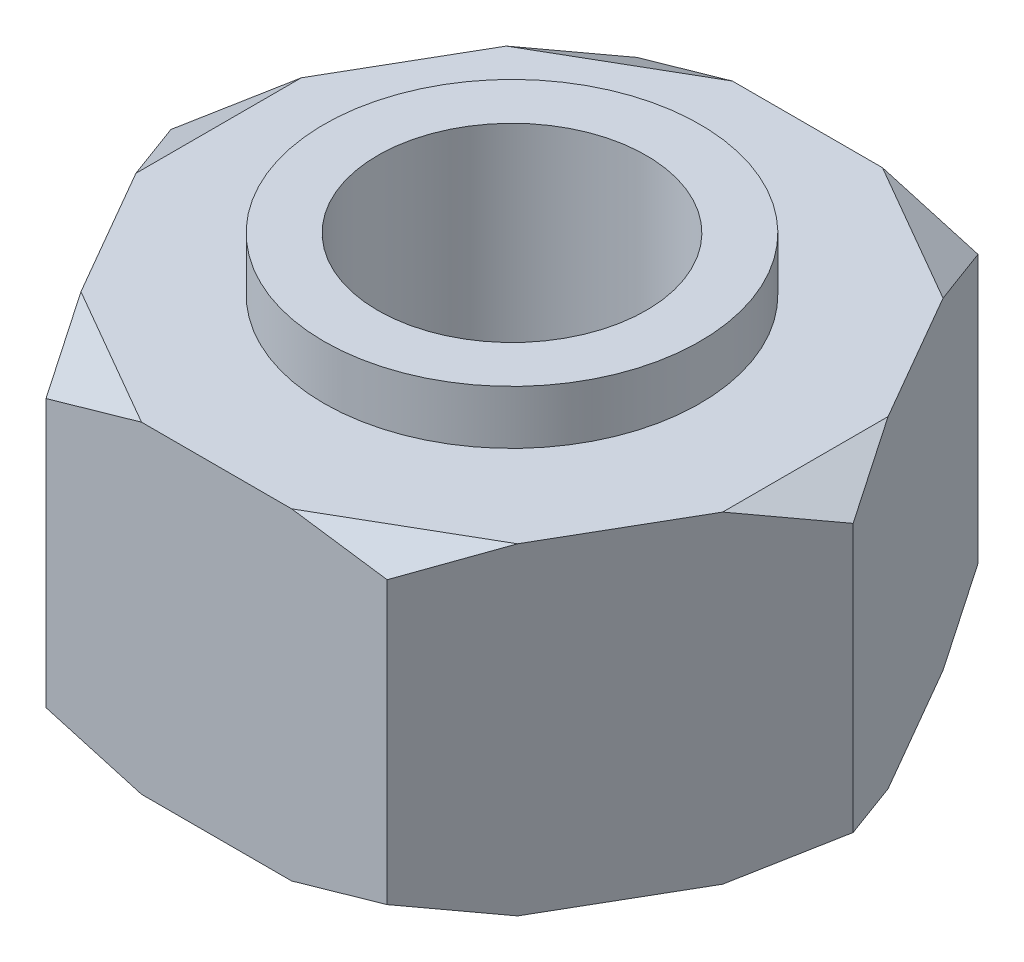
ISO-10303-21;
HEADER;
FILE_DESCRIPTION(('STEP AP214'),'2;1');
FILE_NAME('part.step','',(''),(''),'','','');
FILE_SCHEMA(('AUTOMOTIVE_DESIGN { 1 0 10303 214 1 1 1 1 }'));
ENDSEC;
DATA;
#1=APPLICATION_CONTEXT('core data for automotive mechanical design processes');
#2=APPLICATION_PROTOCOL_DEFINITION('international standard','automotive_design',2000,#1);
#3=PRODUCT_CONTEXT('',#1,'mechanical');
#4=PRODUCT('Part','Part','',(#3));
#5=PRODUCT_RELATED_PRODUCT_CATEGORY('part','',(#4));
#6=PRODUCT_DEFINITION_FORMATION('','',#4);
#7=PRODUCT_DEFINITION_CONTEXT('part definition',#1,'design');
#8=PRODUCT_DEFINITION('design','',#6,#7);
#9=PRODUCT_DEFINITION_SHAPE('','',#8);
#10=(LENGTH_UNIT() NAMED_UNIT(*) SI_UNIT(.MILLI.,.METRE.));
#11=(NAMED_UNIT(*) PLANE_ANGLE_UNIT() SI_UNIT($,.RADIAN.));
#12=(NAMED_UNIT(*) SI_UNIT($,.STERADIAN.) SOLID_ANGLE_UNIT());
#13=UNCERTAINTY_MEASURE_WITH_UNIT(LENGTH_MEASURE(1.E-05),#10,'distance_accuracy_value','');
#14=(GEOMETRIC_REPRESENTATION_CONTEXT(3) GLOBAL_UNCERTAINTY_ASSIGNED_CONTEXT((#13)) GLOBAL_UNIT_ASSIGNED_CONTEXT((#10,
#11,#12)) REPRESENTATION_CONTEXT('',''));
#15=CARTESIAN_POINT('',(0.,0.,0.));
#16=DIRECTION('',(0.,0.,1.));
#17=DIRECTION('',(1.,0.,0.));
#18=AXIS2_PLACEMENT_3D('',#15,#16,#17);
#19=CARTESIAN_POINT('',(0.,0.,0.));
#20=DIRECTION('',(0.,1.,0.));
#21=DIRECTION('',(0.,0.,1.));
#22=AXIS2_PLACEMENT_3D('',#19,#20,#21);
#23=PLANE('',#22);
#24=CARTESIAN_POINT('',(0.,0.,0.));
#25=DIRECTION('',(0.,1.,0.));
#26=DIRECTION('',(0.,0.,1.));
#27=AXIS2_PLACEMENT_3D('',#24,#25,#26);
#28=CIRCLE('',#27,2.5);
#29=CARTESIAN_POINT('',(0.,0.,2.5));
#30=VERTEX_POINT('',#29);
#31=EDGE_CURVE('E400',#30,#30,#28,.F.);
#32=ORIENTED_EDGE('',*,*,#31,.F.);
#33=EDGE_LOOP('',(#32));
#34=FACE_BOUND('',#33,.T.);
#35=DIRECTION('',(-0.5,0.,0.866025403784438));
#36=VECTOR('',#35,1.);
#37=CARTESIAN_POINT('',(-3.17542648054294,0.,-5.5));
#38=LINE('',#37,#36);
#39=CARTESIAN_POINT('',(-4.06442648054294,0.,-3.96020683207127));
#40=VERTEX_POINT('',#39);
#41=CARTESIAN_POINT('',(-5.46185296108588,0.,-1.53979316792873));
#42=VERTEX_POINT('',#41);
#43=EDGE_CURVE('E175',#40,#42,#38,.T.);
#44=ORIENTED_EDGE('',*,*,#43,.F.);
#45=DIRECTION('',(0.866025403784439,0.,-0.5));
#46=VECTOR('',#45,1.);
#47=CARTESIAN_POINT('',(-2.73092648054294,0.,-4.73010341603564));
#48=LINE('',#47,#46);
#49=CARTESIAN_POINT('',(-1.39742648054295,0.,-5.5));
#50=VERTEX_POINT('',#49);
#51=EDGE_CURVE('E11',#40,#50,#48,.T.);
#52=ORIENTED_EDGE('',*,*,#51,.T.);
#53=DIRECTION('',(-1.,0.,0.));
#54=VECTOR('',#53,1.);
#55=CARTESIAN_POINT('',(3.17542648054294,0.,-5.5));
#56=LINE('',#55,#54);
#57=CARTESIAN_POINT('',(1.39742648054294,0.,-5.5));
#58=VERTEX_POINT('',#57);
#59=EDGE_CURVE('E184',#58,#50,#56,.T.);
#60=ORIENTED_EDGE('',*,*,#59,.F.);
#61=DIRECTION('',(-0.866025403784439,0.,-0.5));
#62=VECTOR('',#61,1.);
#63=CARTESIAN_POINT('',(2.73092648054294,0.,-4.73010341603564));
#64=LINE('',#63,#62);
#65=CARTESIAN_POINT('',(4.06442648054294,0.,-3.96020683207127));
#66=VERTEX_POINT('',#65);
#67=EDGE_CURVE('E297',#66,#58,#64,.T.);
#68=ORIENTED_EDGE('',*,*,#67,.F.);
#69=DIRECTION('',(-0.5,0.,-0.866025403784439));
#70=VECTOR('',#69,1.);
#71=CARTESIAN_POINT('',(6.35085296108588,0.,0.));
#72=LINE('',#71,#70);
#73=CARTESIAN_POINT('',(5.46185296108588,0.,-1.53979316792873));
#74=VERTEX_POINT('',#73);
#75=EDGE_CURVE('E190',#74,#66,#72,.T.);
#76=ORIENTED_EDGE('',*,*,#75,.F.);
#77=DIRECTION('',(0.,0.,-1.));
#78=VECTOR('',#77,1.);
#79=CARTESIAN_POINT('',(5.46185296108588,0.,0.));
#80=LINE('',#79,#78);
#81=CARTESIAN_POINT('',(5.46185296108589,0.,1.53979316792872));
#82=VERTEX_POINT('',#81);
#83=EDGE_CURVE('E309',#82,#74,#80,.T.);
#84=ORIENTED_EDGE('',*,*,#83,.F.);
#85=DIRECTION('',(0.5,0.,-0.866025403784439));
#86=VECTOR('',#85,1.);
#87=CARTESIAN_POINT('',(3.17542648054294,0.,5.5));
#88=LINE('',#87,#86);
#89=CARTESIAN_POINT('',(4.06442648054294,0.,3.96020683207127));
#90=VERTEX_POINT('',#89);
#91=EDGE_CURVE('E386',#90,#82,#88,.T.);
#92=ORIENTED_EDGE('',*,*,#91,.F.);
#93=DIRECTION('',(0.866025403784439,0.,-0.5));
#94=VECTOR('',#93,1.);
#95=CARTESIAN_POINT('',(2.73092648054294,0.,4.73010341603564));
#96=LINE('',#95,#94);
#97=CARTESIAN_POINT('',(1.39742648054294,0.,5.5));
#98=VERTEX_POINT('',#97);
#99=EDGE_CURVE('E321',#98,#90,#96,.T.);
#100=ORIENTED_EDGE('',*,*,#99,.F.);
#101=DIRECTION('',(1.,0.,0.));
#102=VECTOR('',#101,1.);
#103=CARTESIAN_POINT('',(-3.17542648054294,0.,5.5));
#104=LINE('',#103,#102);
#105=CARTESIAN_POINT('',(-1.39742648054294,0.,5.5));
#106=VERTEX_POINT('',#105);
#107=EDGE_CURVE('E188',#106,#98,#104,.T.);
#108=ORIENTED_EDGE('',*,*,#107,.F.);
#109=DIRECTION('',(0.866025403784439,0.,0.5));
#110=VECTOR('',#109,1.);
#111=CARTESIAN_POINT('',(-2.73092648054294,0.,4.73010341603564));
#112=LINE('',#111,#110);
#113=CARTESIAN_POINT('',(-4.06442648054294,0.,3.96020683207127));
#114=VERTEX_POINT('',#113);
#115=EDGE_CURVE('E333',#114,#106,#112,.T.);
#116=ORIENTED_EDGE('',*,*,#115,.F.);
#117=DIRECTION('',(0.5,0.,0.866025403784439));
#118=VECTOR('',#117,1.);
#119=CARTESIAN_POINT('',(-6.35085296108588,0.,0.));
#120=LINE('',#119,#118);
#121=CARTESIAN_POINT('',(-5.46185296108588,0.,1.53979316792873));
#122=VERTEX_POINT('',#121);
#123=EDGE_CURVE('E183',#122,#114,#120,.T.);
#124=ORIENTED_EDGE('',*,*,#123,.F.);
#125=DIRECTION('',(0.,0.,1.));
#126=VECTOR('',#125,1.);
#127=CARTESIAN_POINT('',(-5.46185296108588,0.,0.));
#128=LINE('',#127,#126);
#129=EDGE_CURVE('E181',#42,#122,#128,.T.);
#130=ORIENTED_EDGE('',*,*,#129,.F.);
#131=EDGE_LOOP('',(#44,#52,#60,#68,#76,#84,#92,#100,#108,#116,#124,#130));
#132=FACE_BOUND('',#131,.T.);
#133=ADVANCED_FACE('F45',(#34,#132),#23,.F.);
#134=CARTESIAN_POINT('',(-3.17542648054294,6.,-5.5));
#135=DIRECTION('',(0.866025403784439,0.,0.5));
#136=DIRECTION('',(0.5,0.,-0.866025403784439));
#137=AXIS2_PLACEMENT_3D('',#134,#135,#136);
#138=PLANE('',#137);
#139=DIRECTION('',(0.,-1.,0.));
#140=VECTOR('',#139,1.);
#141=CARTESIAN_POINT('',(-3.17542648054294,6.,-5.5));
#142=LINE('',#141,#140);
#143=CARTESIAN_POINT('',(-3.17542648054294,5.492,-5.5));
#144=VERTEX_POINT('',#143);
#145=CARTESIAN_POINT('',(-3.17542648054294,0.507999999999998,-5.5));
#146=VERTEX_POINT('',#145);
#147=EDGE_CURVE('E178',#144,#146,#142,.T.);
#148=ORIENTED_EDGE('',*,*,#147,.T.);
#149=DIRECTION('',(-0.480761973820412,-0.274721127897378,0.832704165004051));
#150=VECTOR('',#149,1.);
#151=CARTESIAN_POINT('',(-2.4500679899769,0.922490566037735,-6.75635775936185));
#152=LINE('',#151,#150);
#153=EDGE_CURVE('E54',#146,#40,#152,.T.);
#154=ORIENTED_EDGE('',*,*,#153,.T.);
#155=ORIENTED_EDGE('',*,*,#43,.T.);
#156=DIRECTION('',(0.480761973820412,-0.274721127897378,-0.832704165004051));
#157=VECTOR('',#156,1.);
#158=CARTESIAN_POINT('',(-4.1404397998292,-0.755093235003819,-3.82854790101551));
#159=LINE('',#158,#157);
#160=CARTESIAN_POINT('',(-6.35085296108588,0.507999999999999,0.));
#161=VERTEX_POINT('',#160);
#162=EDGE_CURVE('E68',#161,#42,#159,.T.);
#163=ORIENTED_EDGE('',*,*,#162,.F.);
#164=DIRECTION('',(0.,-1.,0.));
#165=VECTOR('',#164,1.);
#166=CARTESIAN_POINT('',(-6.35085296108588,6.,0.));
#167=LINE('',#166,#165);
#168=CARTESIAN_POINT('',(-6.35085296108588,5.492,0.));
#169=VERTEX_POINT('',#168);
#170=EDGE_CURVE('E206',#169,#161,#167,.T.);
#171=ORIENTED_EDGE('',*,*,#170,.F.);
#172=DIRECTION('',(-0.480761973820412,-0.274721127897378,0.832704165004051));
#173=VECTOR('',#172,1.);
#174=CARTESIAN_POINT('',(-3.34798696964052,7.20792342368306,-5.20111646550405));
#175=LINE('',#174,#173);
#176=CARTESIAN_POINT('',(-5.46185296108588,6.,-1.53979316792873));
#177=VERTEX_POINT('',#176);
#178=EDGE_CURVE('E269',#177,#169,#175,.T.);
#179=ORIENTED_EDGE('',*,*,#178,.F.);
#180=DIRECTION('',(-0.5,0.,0.866025403784438));
#181=VECTOR('',#180,1.);
#182=CARTESIAN_POINT('',(-3.17542648054294,6.,-5.5));
#183=LINE('',#182,#181);
#184=CARTESIAN_POINT('',(-4.06442648054294,6.,-3.96020683207127));
#185=VERTEX_POINT('',#184);
#186=EDGE_CURVE('E373',#185,#177,#183,.T.);
#187=ORIENTED_EDGE('',*,*,#186,.F.);
#188=DIRECTION('',(-0.480761973820412,0.274721127897378,0.832704165004051));
#189=VECTOR('',#188,1.);
#190=CARTESIAN_POINT('',(-3.24252082016558,5.53033962264151,-5.3837891948733));
#191=LINE('',#190,#189);
#192=EDGE_CURVE('E261',#144,#185,#191,.T.);
#193=ORIENTED_EDGE('',*,*,#192,.F.);
#194=EDGE_LOOP('',(#148,#154,#155,#163,#171,#179,#187,#193));
#195=FACE_BOUND('',#194,.T.);
#196=ADVANCED_FACE('F174',(#195),#138,.F.);
#197=CARTESIAN_POINT('',(3.17542648054294,6.,-5.5));
#198=DIRECTION('',(0.,0.,1.));
#199=DIRECTION('',(1.,0.,0.));
#200=AXIS2_PLACEMENT_3D('',#197,#198,#199);
#201=PLANE('',#200);
#202=ORIENTED_EDGE('',*,*,#59,.T.);
#203=DIRECTION('',(-0.961523947640823,0.274721127897378,0.));
#204=VECTOR('',#203,1.);
#205=CARTESIAN_POINT('',(1.24539984197042,-0.755093235003819,-5.5));
#206=LINE('',#205,#204);
#207=EDGE_CURVE('E61',#50,#146,#206,.T.);
#208=ORIENTED_EDGE('',*,*,#207,.T.);
#209=ORIENTED_EDGE('',*,*,#147,.F.);
#210=DIRECTION('',(-0.961523947640823,-0.274721127897378,0.));
#211=VECTOR('',#210,1.);
#212=CARTESIAN_POINT('',(2.83030550234778,7.20792342368306,-5.5));
#213=LINE('',#212,#211);
#214=CARTESIAN_POINT('',(-1.39742648054294,6.,-5.5));
#215=VERTEX_POINT('',#214);
#216=EDGE_CURVE('E257',#215,#144,#213,.T.);
#217=ORIENTED_EDGE('',*,*,#216,.F.);
#218=DIRECTION('',(-1.,0.,0.));
#219=VECTOR('',#218,1.);
#220=CARTESIAN_POINT('',(3.17542648054294,6.,-5.5));
#221=LINE('',#220,#219);
#222=CARTESIAN_POINT('',(1.39742648054293,6.,-5.5));
#223=VERTEX_POINT('',#222);
#224=EDGE_CURVE('E358',#223,#215,#221,.T.);
#225=ORIENTED_EDGE('',*,*,#224,.F.);
#226=DIRECTION('',(-0.961523947640823,0.274721127897378,0.));
#227=VECTOR('',#226,1.);
#228=CARTESIAN_POINT('',(3.04123780129766,5.53033962264151,-5.5));
#229=LINE('',#228,#227);
#230=CARTESIAN_POINT('',(3.17542648054294,5.492,-5.5));
#231=VERTEX_POINT('',#230);
#232=EDGE_CURVE('E249',#231,#223,#229,.T.);
#233=ORIENTED_EDGE('',*,*,#232,.F.);
#234=DIRECTION('',(0.,-1.,0.));
#235=VECTOR('',#234,1.);
#236=CARTESIAN_POINT('',(3.17542648054294,6.,-5.5));
#237=LINE('',#236,#235);
#238=CARTESIAN_POINT('',(3.17542648054294,0.507999999999999,-5.5));
#239=VERTEX_POINT('',#238);
#240=EDGE_CURVE('E211',#231,#239,#237,.T.);
#241=ORIENTED_EDGE('',*,*,#240,.T.);
#242=DIRECTION('',(0.961523947640823,0.274721127897378,0.));
#243=VECTOR('',#242,1.);
#244=CARTESIAN_POINT('',(4.62614346167502,0.922490566037735,-5.5));
#245=LINE('',#244,#243);
#246=EDGE_CURVE('E293',#58,#239,#245,.T.);
#247=ORIENTED_EDGE('',*,*,#246,.F.);
#248=EDGE_LOOP('',(#202,#208,#209,#217,#225,#233,#241,#247));
#249=FACE_BOUND('',#248,.T.);
#250=ADVANCED_FACE('F347',(#249),#201,.F.);
#251=CARTESIAN_POINT('',(0.,6.,0.));
#252=DIRECTION('',(0.,1.,0.));
#253=DIRECTION('',(0.,0.,1.));
#254=AXIS2_PLACEMENT_3D('',#251,#252,#253);
#255=PLANE('',#254);
#256=CARTESIAN_POINT('',(0.,6.,0.));
#257=DIRECTION('',(0.,1.,0.));
#258=DIRECTION('',(0.,0.,1.));
#259=AXIS2_PLACEMENT_3D('',#256,#257,#258);
#260=CIRCLE('',#259,3.5);
#261=CARTESIAN_POINT('',(0.,6.,3.5));
#262=VERTEX_POINT('',#261);
#263=EDGE_CURVE('E393',#262,#262,#260,.T.);
#264=ORIENTED_EDGE('',*,*,#263,.F.);
#265=EDGE_LOOP('',(#264));
#266=FACE_BOUND('',#265,.T.);
#267=DIRECTION('',(0.5,0.,0.866025403784439));
#268=VECTOR('',#267,1.);
#269=CARTESIAN_POINT('',(-6.35085296108588,6.,0.));
#270=LINE('',#269,#268);
#271=CARTESIAN_POINT('',(-5.46185296108588,6.,1.53979316792873));
#272=VERTEX_POINT('',#271);
#273=CARTESIAN_POINT('',(-4.06442648054294,6.,3.96020683207127));
#274=VERTEX_POINT('',#273);
#275=EDGE_CURVE('E381',#272,#274,#270,.T.);
#276=ORIENTED_EDGE('',*,*,#275,.T.);
#277=DIRECTION('',(0.866025403784439,0.,0.5));
#278=VECTOR('',#277,1.);
#279=CARTESIAN_POINT('',(-2.73092648054294,6.,4.73010341603563));
#280=LINE('',#279,#278);
#281=CARTESIAN_POINT('',(-1.39742648054294,6.,5.5));
#282=VERTEX_POINT('',#281);
#283=EDGE_CURVE('E277',#274,#282,#280,.T.);
#284=ORIENTED_EDGE('',*,*,#283,.T.);
#285=DIRECTION('',(1.,0.,0.));
#286=VECTOR('',#285,1.);
#287=CARTESIAN_POINT('',(-3.17542648054294,6.,5.5));
#288=LINE('',#287,#286);
#289=CARTESIAN_POINT('',(1.39742648054294,6.,5.5));
#290=VERTEX_POINT('',#289);
#291=EDGE_CURVE('E202',#282,#290,#288,.T.);
#292=ORIENTED_EDGE('',*,*,#291,.T.);
#293=DIRECTION('',(0.866025403784438,0.,-0.5));
#294=VECTOR('',#293,1.);
#295=CARTESIAN_POINT('',(2.73092648054294,6.,4.73010341603563));
#296=LINE('',#295,#294);
#297=CARTESIAN_POINT('',(4.06442648054295,6.,3.96020683207126));
#298=VERTEX_POINT('',#297);
#299=EDGE_CURVE('E225',#290,#298,#296,.T.);
#300=ORIENTED_EDGE('',*,*,#299,.T.);
#301=DIRECTION('',(0.5,0.,-0.866025403784439));
#302=VECTOR('',#301,1.);
#303=CARTESIAN_POINT('',(3.17542648054294,6.,5.5));
#304=LINE('',#303,#302);
#305=CARTESIAN_POINT('',(5.46185296108588,6.,1.53979316792873));
#306=VERTEX_POINT('',#305);
#307=EDGE_CURVE('E196',#298,#306,#304,.T.);
#308=ORIENTED_EDGE('',*,*,#307,.T.);
#309=DIRECTION('',(0.,0.,-1.));
#310=VECTOR('',#309,1.);
#311=CARTESIAN_POINT('',(5.46185296108588,6.,0.));
#312=LINE('',#311,#310);
#313=CARTESIAN_POINT('',(5.46185296108588,6.,-1.53979316792873));
#314=VERTEX_POINT('',#313);
#315=EDGE_CURVE('E229',#306,#314,#312,.T.);
#316=ORIENTED_EDGE('',*,*,#315,.T.);
#317=DIRECTION('',(-0.5,0.,-0.866025403784439));
#318=VECTOR('',#317,1.);
#319=CARTESIAN_POINT('',(6.35085296108588,6.,0.));
#320=LINE('',#319,#318);
#321=CARTESIAN_POINT('',(4.06442648054295,6.,-3.96020683207126));
#322=VERTEX_POINT('',#321);
#323=EDGE_CURVE('E363',#314,#322,#320,.T.);
#324=ORIENTED_EDGE('',*,*,#323,.T.);
#325=DIRECTION('',(-0.866025403784439,0.,-0.5));
#326=VECTOR('',#325,1.);
#327=CARTESIAN_POINT('',(2.73092648054294,6.,-4.73010341603563));
#328=LINE('',#327,#326);
#329=EDGE_CURVE('E241',#322,#223,#328,.T.);
#330=ORIENTED_EDGE('',*,*,#329,.T.);
#331=ORIENTED_EDGE('',*,*,#224,.T.);
#332=DIRECTION('',(-0.866025403784439,0.,0.5));
#333=VECTOR('',#332,1.);
#334=CARTESIAN_POINT('',(-2.73092648054294,6.,-4.73010341603563));
#335=LINE('',#334,#333);
#336=EDGE_CURVE('E253',#215,#185,#335,.T.);
#337=ORIENTED_EDGE('',*,*,#336,.T.);
#338=ORIENTED_EDGE('',*,*,#186,.T.);
#339=DIRECTION('',(0.,0.,1.));
#340=VECTOR('',#339,1.);
#341=CARTESIAN_POINT('',(-5.46185296108588,6.,0.));
#342=LINE('',#341,#340);
#343=EDGE_CURVE('E265',#177,#272,#342,.T.);
#344=ORIENTED_EDGE('',*,*,#343,.T.);
#345=EDGE_LOOP('',(#276,#284,#292,#300,#308,#316,#324,#330,#331,#337,#338,#344));
#346=FACE_BOUND('',#345,.T.);
#347=ADVANCED_FACE('F366',(#266,#346),#255,.T.);
#348=CARTESIAN_POINT('',(3.17542648054294,6.,5.5));
#349=DIRECTION('',(-0.866025403784439,0.,-0.5));
#350=DIRECTION('',(-0.5,0.,0.866025403784439));
#351=AXIS2_PLACEMENT_3D('',#348,#349,#350);
#352=PLANE('',#351);
#353=DIRECTION('',(-0.480761973820411,0.274721127897378,0.832704165004052));
#354=VECTOR('',#353,1.);
#355=CARTESIAN_POINT('',(2.45006798997691,0.922490566037736,6.75635775936185));
#356=LINE('',#355,#354);
#357=CARTESIAN_POINT('',(3.17542648054294,0.507999999999999,5.5));
#358=VERTEX_POINT('',#357);
#359=EDGE_CURVE('E313',#90,#358,#356,.T.);
#360=ORIENTED_EDGE('',*,*,#359,.F.);
#361=ORIENTED_EDGE('',*,*,#91,.T.);
#362=DIRECTION('',(-0.480761973820411,-0.274721127897378,0.832704165004052));
#363=VECTOR('',#362,1.);
#364=CARTESIAN_POINT('',(4.1404397998292,-0.755093235003819,3.82854790101551));
#365=LINE('',#364,#363);
#366=CARTESIAN_POINT('',(6.35085296108588,0.508000000000001,0.));
#367=VERTEX_POINT('',#366);
#368=EDGE_CURVE('E301',#367,#82,#365,.T.);
#369=ORIENTED_EDGE('',*,*,#368,.F.);
#370=DIRECTION('',(0.,-1.,0.));
#371=VECTOR('',#370,1.);
#372=CARTESIAN_POINT('',(6.35085296108588,6.,0.));
#373=LINE('',#372,#371);
#374=CARTESIAN_POINT('',(6.35085296108588,5.492,0.));
#375=VERTEX_POINT('',#374);
#376=EDGE_CURVE('E215',#375,#367,#373,.T.);
#377=ORIENTED_EDGE('',*,*,#376,.F.);
#378=DIRECTION('',(0.480761973820411,-0.274721127897378,-0.832704165004052));
#379=VECTOR('',#378,1.);
#380=CARTESIAN_POINT('',(3.34798696964052,7.20792342368306,5.20111646550406));
#381=LINE('',#380,#379);
#382=EDGE_CURVE('E233',#306,#375,#381,.T.);
#383=ORIENTED_EDGE('',*,*,#382,.F.);
#384=ORIENTED_EDGE('',*,*,#307,.F.);
#385=DIRECTION('',(0.494974746830583,0.14142135623731,-0.857321409974113));
#386=VECTOR('',#385,1.);
#387=CARTESIAN_POINT('',(3.19320648054294,5.75108,5.46920413664143));
#388=LINE('',#387,#386);
#389=CARTESIAN_POINT('',(3.17542648054294,5.746,5.5));
#390=VERTEX_POINT('',#389);
#391=EDGE_CURVE('E219',#390,#298,#388,.T.);
#392=ORIENTED_EDGE('',*,*,#391,.F.);
#393=DIRECTION('',(0.,-1.,0.));
#394=VECTOR('',#393,1.);
#395=CARTESIAN_POINT('',(3.17542648054294,6.,5.5));
#396=LINE('',#395,#394);
#397=EDGE_CURVE('E197',#390,#358,#396,.T.);
#398=ORIENTED_EDGE('',*,*,#397,.T.);
#399=EDGE_LOOP('',(#360,#361,#369,#377,#383,#384,#392,#398));
#400=FACE_BOUND('',#399,.T.);
#401=ADVANCED_FACE('F47',(#400),#352,.F.);
#402=CARTESIAN_POINT('',(6.35085296108588,6.,0.));
#403=DIRECTION('',(-0.866025403784438,0.,0.5));
#404=DIRECTION('',(0.5,0.,0.866025403784439));
#405=AXIS2_PLACEMENT_3D('',#402,#403,#404);
#406=PLANE('',#405);
#407=DIRECTION('',(0.480761973820412,0.274721127897378,0.832704165004051));
#408=VECTOR('',#407,1.);
#409=CARTESIAN_POINT('',(7.07621145165192,0.922490566037737,1.25635775936185));
#410=LINE('',#409,#408);
#411=EDGE_CURVE('E305',#74,#367,#410,.T.);
#412=ORIENTED_EDGE('',*,*,#411,.F.);
#413=ORIENTED_EDGE('',*,*,#75,.T.);
#414=DIRECTION('',(0.480761973820412,-0.274721127897378,0.832704165004051));
#415=VECTOR('',#414,1.);
#416=CARTESIAN_POINT('',(5.38583964179962,-0.755093235003819,-1.67145209898449));
#417=LINE('',#416,#415);
#418=EDGE_CURVE('E289',#239,#66,#417,.T.);
#419=ORIENTED_EDGE('',*,*,#418,.F.);
#420=ORIENTED_EDGE('',*,*,#240,.F.);
#421=DIRECTION('',(-0.480761973820412,-0.274721127897378,-0.832704165004051));
#422=VECTOR('',#421,1.);
#423=CARTESIAN_POINT('',(6.1782924719883,7.20792342368306,-0.298883534495946));
#424=LINE('',#423,#422);
#425=EDGE_CURVE('E245',#322,#231,#424,.T.);
#426=ORIENTED_EDGE('',*,*,#425,.F.);
#427=ORIENTED_EDGE('',*,*,#323,.F.);
#428=DIRECTION('',(-0.480761973820412,0.274721127897378,-0.832704165004051));
#429=VECTOR('',#428,1.);
#430=CARTESIAN_POINT('',(6.28375862146324,5.53033962264151,-0.116210805126698));
#431=LINE('',#430,#429);
#432=EDGE_CURVE('E237',#375,#314,#431,.T.);
#433=ORIENTED_EDGE('',*,*,#432,.F.);
#434=ORIENTED_EDGE('',*,*,#376,.T.);
#435=EDGE_LOOP('',(#412,#413,#419,#420,#426,#427,#433,#434));
#436=FACE_BOUND('',#435,.T.);
#437=ADVANCED_FACE('F356',(#436),#406,.F.);
#438=CARTESIAN_POINT('',(-6.35085296108588,6.,0.));
#439=DIRECTION('',(0.866025403784439,0.,-0.5));
#440=DIRECTION('',(-0.5,0.,-0.866025403784439));
#441=AXIS2_PLACEMENT_3D('',#438,#439,#440);
#442=PLANE('',#441);
#443=DIRECTION('',(-0.480761973820412,0.274721127897378,-0.832704165004051));
#444=VECTOR('',#443,1.);
#445=CARTESIAN_POINT('',(-7.07621145165192,0.922490566037736,-1.25635775936185));
#446=LINE('',#445,#444);
#447=EDGE_CURVE('E339',#122,#161,#446,.T.);
#448=ORIENTED_EDGE('',*,*,#447,.F.);
#449=ORIENTED_EDGE('',*,*,#123,.T.);
#450=DIRECTION('',(-0.480761973820412,-0.274721127897378,-0.832704165004051));
#451=VECTOR('',#450,1.);
#452=CARTESIAN_POINT('',(-5.38583964179962,-0.75509323500382,1.67145209898449));
#453=LINE('',#452,#451);
#454=CARTESIAN_POINT('',(-3.17542648054294,0.507999999999999,5.5));
#455=VERTEX_POINT('',#454);
#456=EDGE_CURVE('E325',#455,#114,#453,.T.);
#457=ORIENTED_EDGE('',*,*,#456,.F.);
#458=DIRECTION('',(0.,-1.,0.));
#459=VECTOR('',#458,1.);
#460=CARTESIAN_POINT('',(-3.17542648054294,6.,5.5));
#461=LINE('',#460,#459);
#462=CARTESIAN_POINT('',(-3.17542648054294,5.492,5.5));
#463=VERTEX_POINT('',#462);
#464=EDGE_CURVE('E201',#463,#455,#461,.T.);
#465=ORIENTED_EDGE('',*,*,#464,.F.);
#466=DIRECTION('',(0.480761973820412,-0.274721127897378,0.832704165004051));
#467=VECTOR('',#466,1.);
#468=CARTESIAN_POINT('',(-6.1782924719883,7.20792342368306,0.298883534495945));
#469=LINE('',#468,#467);
#470=EDGE_CURVE('E281',#274,#463,#469,.T.);
#471=ORIENTED_EDGE('',*,*,#470,.F.);
#472=ORIENTED_EDGE('',*,*,#275,.F.);
#473=DIRECTION('',(0.480761973820412,0.274721127897378,0.832704165004051));
#474=VECTOR('',#473,1.);
#475=CARTESIAN_POINT('',(-6.28375862146324,5.53033962264151,0.116210805126697));
#476=LINE('',#475,#474);
#477=EDGE_CURVE('E273',#169,#272,#476,.T.);
#478=ORIENTED_EDGE('',*,*,#477,.F.);
#479=ORIENTED_EDGE('',*,*,#170,.T.);
#480=EDGE_LOOP('',(#448,#449,#457,#465,#471,#472,#478,#479));
#481=FACE_BOUND('',#480,.T.);
#482=ADVANCED_FACE('F422',(#481),#442,.F.);
#483=CARTESIAN_POINT('',(-3.17542648054294,6.,5.5));
#484=DIRECTION('',(0.,0.,-1.));
#485=DIRECTION('',(-1.,0.,0.));
#486=AXIS2_PLACEMENT_3D('',#483,#484,#485);
#487=PLANE('',#486);
#488=DIRECTION('',(-0.961523947640823,0.274721127897378,0.));
#489=VECTOR('',#488,1.);
#490=CARTESIAN_POINT('',(-4.62614346167502,0.922490566037735,5.5));
#491=LINE('',#490,#489);
#492=EDGE_CURVE('E329',#106,#455,#491,.T.);
#493=ORIENTED_EDGE('',*,*,#492,.F.);
#494=ORIENTED_EDGE('',*,*,#107,.T.);
#495=DIRECTION('',(-0.961523947640823,-0.274721127897378,0.));
#496=VECTOR('',#495,1.);
#497=CARTESIAN_POINT('',(-1.24539984197042,-0.755093235003819,5.5));
#498=LINE('',#497,#496);
#499=EDGE_CURVE('E317',#358,#98,#498,.T.);
#500=ORIENTED_EDGE('',*,*,#499,.F.);
#501=ORIENTED_EDGE('',*,*,#397,.F.);
#502=DIRECTION('',(0.989949493661167,-0.14142135623731,0.));
#503=VECTOR('',#502,1.);
#504=CARTESIAN_POINT('',(-3.08396942132122,6.64019941455202,5.5));
#505=LINE('',#504,#503);
#506=EDGE_CURVE('E222',#290,#390,#505,.T.);
#507=ORIENTED_EDGE('',*,*,#506,.F.);
#508=ORIENTED_EDGE('',*,*,#291,.F.);
#509=DIRECTION('',(0.961523947640823,0.274721127897378,0.));
#510=VECTOR('',#509,1.);
#511=CARTESIAN_POINT('',(-3.04123780129766,5.53033962264151,5.5));
#512=LINE('',#511,#510);
#513=EDGE_CURVE('E285',#463,#282,#512,.T.);
#514=ORIENTED_EDGE('',*,*,#513,.F.);
#515=ORIENTED_EDGE('',*,*,#464,.T.);
#516=EDGE_LOOP('',(#493,#494,#500,#501,#507,#508,#514,#515));
#517=FACE_BOUND('',#516,.T.);
#518=ADVANCED_FACE('F418',(#517),#487,.F.);
#519=CARTESIAN_POINT('',(0.,7.,0.));
#520=DIRECTION('',(0.,1.,0.));
#521=DIRECTION('',(0.,0.,1.));
#522=AXIS2_PLACEMENT_3D('',#519,#520,#521);
#523=PLANE('',#522);
#524=CARTESIAN_POINT('',(0.,7.,0.));
#525=DIRECTION('',(0.,1.,0.));
#526=DIRECTION('',(0.,0.,1.));
#527=AXIS2_PLACEMENT_3D('',#524,#525,#526);
#528=CIRCLE('',#527,3.5);
#529=CARTESIAN_POINT('',(0.,7.,3.5));
#530=VERTEX_POINT('',#529);
#531=EDGE_CURVE('E388',#530,#530,#528,.T.);
#532=ORIENTED_EDGE('',*,*,#531,.T.);
#533=EDGE_LOOP('',(#532));
#534=FACE_BOUND('',#533,.T.);
#535=CARTESIAN_POINT('',(0.,7.,0.));
#536=DIRECTION('',(0.,1.,0.));
#537=DIRECTION('',(0.,0.,1.));
#538=AXIS2_PLACEMENT_3D('',#535,#536,#537);
#539=CIRCLE('',#538,2.5);
#540=CARTESIAN_POINT('',(0.,7.,2.5));
#541=VERTEX_POINT('',#540);
#542=EDGE_CURVE('E397',#541,#541,#539,.T.);
#543=ORIENTED_EDGE('',*,*,#542,.F.);
#544=EDGE_LOOP('',(#543));
#545=FACE_BOUND('',#544,.T.);
#546=ADVANCED_FACE('F421',(#534,#545),#523,.T.);
#547=CARTESIAN_POINT('',(0.,7.,0.));
#548=DIRECTION('',(0.,-1.,0.));
#549=DIRECTION('',(0.,0.,-1.));
#550=AXIS2_PLACEMENT_3D('',#547,#548,#549);
#551=CYLINDRICAL_SURFACE('',#550,3.5);
#552=ORIENTED_EDGE('',*,*,#531,.F.);
#553=EDGE_LOOP('',(#552));
#554=FACE_BOUND('',#553,.T.);
#555=ORIENTED_EDGE('',*,*,#263,.T.);
#556=EDGE_LOOP('',(#555));
#557=FACE_BOUND('',#556,.T.);
#558=ADVANCED_FACE('F495',(#554,#557),#551,.T.);
#559=CARTESIAN_POINT('',(0.,7.,0.));
#560=DIRECTION('',(0.,-1.,0.));
#561=DIRECTION('',(0.,0.,-1.));
#562=AXIS2_PLACEMENT_3D('',#559,#560,#561);
#563=CYLINDRICAL_SURFACE('',#562,2.5);
#564=ORIENTED_EDGE('',*,*,#542,.T.);
#565=EDGE_LOOP('',(#564));
#566=FACE_BOUND('',#565,.T.);
#567=ORIENTED_EDGE('',*,*,#31,.T.);
#568=EDGE_LOOP('',(#567));
#569=FACE_BOUND('',#568,.T.);
#570=ADVANCED_FACE('F406',(#566,#569),#563,.F.);
#571=CARTESIAN_POINT('',(0.998560489097582,6.98992342368306,1.72955750154784));
#572=DIRECTION('',(0.137360563948689,0.961523947640823,0.237915475715443));
#573=DIRECTION('',(0.,-0.240192230707631,0.970725343394151));
#574=AXIS2_PLACEMENT_3D('',#571,#572,#573);
#575=PLANE('',#574);
#576=ORIENTED_EDGE('',*,*,#506,.T.);
#577=ORIENTED_EDGE('',*,*,#391,.T.);
#578=ORIENTED_EDGE('',*,*,#299,.F.);
#579=EDGE_LOOP('',(#576,#577,#578));
#580=FACE_BOUND('',#579,.T.);
#581=ADVANCED_FACE('F457',(#580),#575,.T.);
#582=CARTESIAN_POINT('',(3.92907149811345,6.87587512169853,0.));
#583=DIRECTION('',(0.496138938356834,0.868243142124459,0.));
#584=DIRECTION('',(-0.868243142124459,0.496138938356834,0.));
#585=AXIS2_PLACEMENT_3D('',#582,#583,#584);
#586=PLANE('',#585);
#587=ORIENTED_EDGE('',*,*,#315,.F.);
#588=ORIENTED_EDGE('',*,*,#382,.T.);
#589=ORIENTED_EDGE('',*,*,#432,.T.);
#590=EDGE_LOOP('',(#587,#588,#589));
#591=FACE_BOUND('',#590,.T.);
#592=ADVANCED_FACE('F452',(#591),#586,.T.);
#593=CARTESIAN_POINT('',(1.96453574905672,6.87587512169853,-3.40267573065163));
#594=DIRECTION('',(0.248069469178417,0.868243142124459,-0.42966892442366));
#595=DIRECTION('',(0.,0.443532762572744,0.896258159530272));
#596=AXIS2_PLACEMENT_3D('',#593,#594,#595);
#597=PLANE('',#596);
#598=ORIENTED_EDGE('',*,*,#329,.F.);
#599=ORIENTED_EDGE('',*,*,#425,.T.);
#600=ORIENTED_EDGE('',*,*,#232,.T.);
#601=EDGE_LOOP('',(#598,#599,#600));
#602=FACE_BOUND('',#601,.T.);
#603=ADVANCED_FACE('F361',(#602),#597,.T.);
#604=CARTESIAN_POINT('',(-1.96453574905672,6.87587512169853,-3.40267573065163));
#605=DIRECTION('',(-0.248069469178417,0.868243142124459,-0.42966892442366));
#606=DIRECTION('',(0.,0.443532762572744,0.896258159530272));
#607=AXIS2_PLACEMENT_3D('',#604,#605,#606);
#608=PLANE('',#607);
#609=ORIENTED_EDGE('',*,*,#336,.F.);
#610=ORIENTED_EDGE('',*,*,#216,.T.);
#611=ORIENTED_EDGE('',*,*,#192,.T.);
#612=EDGE_LOOP('',(#609,#610,#611));
#613=FACE_BOUND('',#612,.T.);
#614=ADVANCED_FACE('F482',(#613),#608,.T.);
#615=CARTESIAN_POINT('',(-3.92907149811345,6.87587512169853,0.));
#616=DIRECTION('',(-0.496138938356834,0.868243142124459,0.));
#617=DIRECTION('',(-0.868243142124459,-0.496138938356834,0.));
#618=AXIS2_PLACEMENT_3D('',#615,#616,#617);
#619=PLANE('',#618);
#620=ORIENTED_EDGE('',*,*,#343,.F.);
#621=ORIENTED_EDGE('',*,*,#178,.T.);
#622=ORIENTED_EDGE('',*,*,#477,.T.);
#623=EDGE_LOOP('',(#620,#621,#622));
#624=FACE_BOUND('',#623,.T.);
#625=ADVANCED_FACE('F478',(#624),#619,.T.);
#626=CARTESIAN_POINT('',(-1.96453574905672,6.87587512169853,3.40267573065163));
#627=DIRECTION('',(-0.248069469178417,0.868243142124459,0.42966892442366));
#628=DIRECTION('',(0.,-0.443532762572744,0.896258159530272));
#629=AXIS2_PLACEMENT_3D('',#626,#627,#628);
#630=PLANE('',#629);
#631=ORIENTED_EDGE('',*,*,#283,.F.);
#632=ORIENTED_EDGE('',*,*,#470,.T.);
#633=ORIENTED_EDGE('',*,*,#513,.T.);
#634=EDGE_LOOP('',(#631,#632,#633));
#635=FACE_BOUND('',#634,.T.);
#636=ADVANCED_FACE('F475',(#635),#630,.T.);
#637=CARTESIAN_POINT('',(0.672228056749032,-2.35279819862161,-1.16433314856262));
#638=DIRECTION('',(0.248069469178417,-0.868243142124459,-0.42966892442366));
#639=DIRECTION('',(0.,0.443532762572744,-0.896258159530272));
#640=AXIS2_PLACEMENT_3D('',#637,#638,#639);
#641=PLANE('',#640);
#642=ORIENTED_EDGE('',*,*,#246,.T.);
#643=ORIENTED_EDGE('',*,*,#418,.T.);
#644=ORIENTED_EDGE('',*,*,#67,.T.);
#645=EDGE_LOOP('',(#642,#643,#644));
#646=FACE_BOUND('',#645,.T.);
#647=ADVANCED_FACE('F353',(#646),#641,.T.);
#648=CARTESIAN_POINT('',(1.34445611349806,-2.35279819862161,0.));
#649=DIRECTION('',(0.496138938356834,-0.868243142124459,0.));
#650=DIRECTION('',(0.868243142124459,0.496138938356834,0.));
#651=AXIS2_PLACEMENT_3D('',#648,#649,#650);
#652=PLANE('',#651);
#653=ORIENTED_EDGE('',*,*,#411,.T.);
#654=ORIENTED_EDGE('',*,*,#368,.T.);
#655=ORIENTED_EDGE('',*,*,#83,.T.);
#656=EDGE_LOOP('',(#653,#654,#655));
#657=FACE_BOUND('',#656,.T.);
#658=ADVANCED_FACE('F449',(#657),#652,.T.);
#659=CARTESIAN_POINT('',(0.672228056749032,-2.35279819862161,1.16433314856262));
#660=DIRECTION('',(0.248069469178417,-0.868243142124459,0.42966892442366));
#661=DIRECTION('',(0.,-0.443532762572744,-0.896258159530272));
#662=AXIS2_PLACEMENT_3D('',#659,#660,#661);
#663=PLANE('',#662);
#664=ORIENTED_EDGE('',*,*,#99,.T.);
#665=ORIENTED_EDGE('',*,*,#359,.T.);
#666=ORIENTED_EDGE('',*,*,#499,.T.);
#667=EDGE_LOOP('',(#664,#665,#666));
#668=FACE_BOUND('',#667,.T.);
#669=ADVANCED_FACE('F445',(#668),#663,.T.);
#670=CARTESIAN_POINT('',(-0.672228056749032,-2.35279819862161,1.16433314856262));
#671=DIRECTION('',(-0.248069469178417,-0.868243142124459,0.42966892442366));
#672=DIRECTION('',(0.,-0.443532762572744,-0.896258159530272));
#673=AXIS2_PLACEMENT_3D('',#670,#671,#672);
#674=PLANE('',#673);
#675=ORIENTED_EDGE('',*,*,#492,.T.);
#676=ORIENTED_EDGE('',*,*,#456,.T.);
#677=ORIENTED_EDGE('',*,*,#115,.T.);
#678=EDGE_LOOP('',(#675,#676,#677));
#679=FACE_BOUND('',#678,.T.);
#680=ADVANCED_FACE('F460',(#679),#674,.T.);
#681=CARTESIAN_POINT('',(-1.34445611349806,-2.35279819862161,0.));
#682=DIRECTION('',(-0.496138938356834,-0.868243142124459,0.));
#683=DIRECTION('',(0.868243142124459,-0.496138938356834,0.));
#684=AXIS2_PLACEMENT_3D('',#681,#682,#683);
#685=PLANE('',#684);
#686=ORIENTED_EDGE('',*,*,#447,.T.);
#687=ORIENTED_EDGE('',*,*,#162,.T.);
#688=ORIENTED_EDGE('',*,*,#129,.T.);
#689=EDGE_LOOP('',(#686,#687,#688));
#690=FACE_BOUND('',#689,.T.);
#691=ADVANCED_FACE('F463',(#690),#685,.T.);
#692=CARTESIAN_POINT('',(-0.672228056749032,-2.35279819862161,-1.16433314856262));
#693=DIRECTION('',(0.248069469178417,0.868243142124459,0.42966892442366));
#694=DIRECTION('',(0.,-0.443532762572744,0.896258159530272));
#695=AXIS2_PLACEMENT_3D('',#692,#693,#694);
#696=PLANE('',#695);
#697=ORIENTED_EDGE('',*,*,#207,.F.);
#698=ORIENTED_EDGE('',*,*,#51,.F.);
#699=ORIENTED_EDGE('',*,*,#153,.F.);
#700=EDGE_LOOP('',(#697,#698,#699));
#701=FACE_BOUND('',#700,.T.);
#702=ADVANCED_FACE('F169',(#701),#696,.F.);
#703=CLOSED_SHELL('',(#133,#196,#250,#347,#401,#437,#482,#518,#546,#558,#570,#581,#592,#603,
#614,#625,#636,#647,#658,#669,#680,#691,#702));
#704=MANIFOLD_SOLID_BREP('B2',#703);
#705=ADVANCED_BREP_SHAPE_REPRESENTATION('',(#18,#704),#14);
#706=SHAPE_DEFINITION_REPRESENTATION(#9,#705);
ENDSEC;
END-ISO-10303-21;
